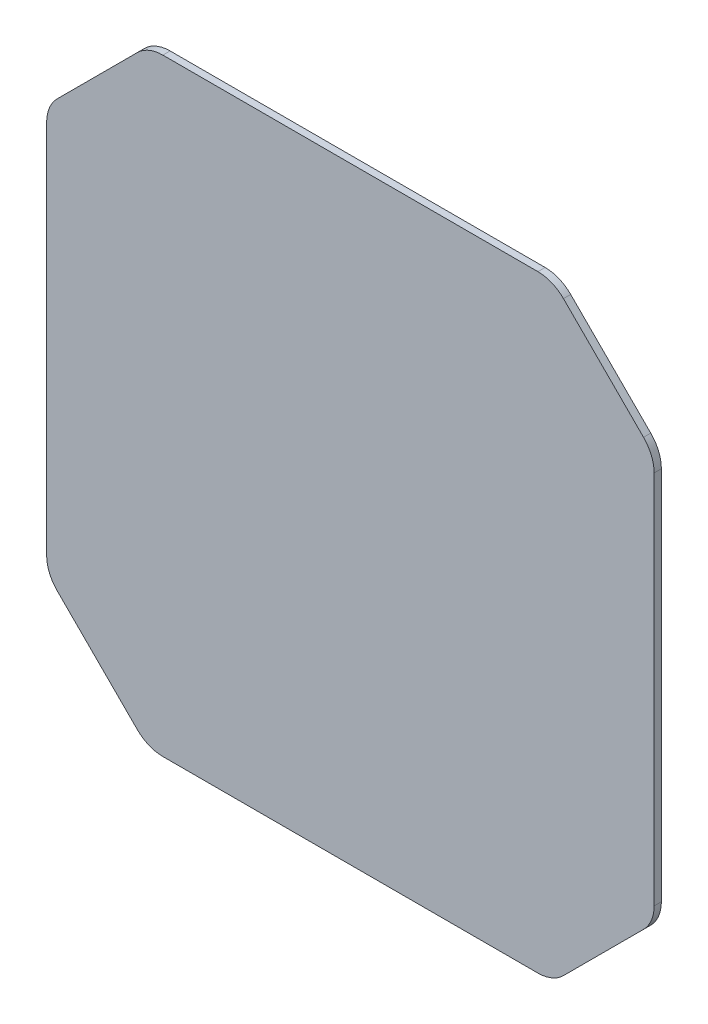
ISO-10303-21;
HEADER;
FILE_DESCRIPTION(('STEP AP214'),'2;1');
FILE_NAME('part.step','',(''),(''),'','','');
FILE_SCHEMA(('AUTOMOTIVE_DESIGN { 1 0 10303 214 1 1 1 1 }'));
ENDSEC;
DATA;
#1=APPLICATION_CONTEXT('core data for automotive mechanical design processes');
#2=APPLICATION_PROTOCOL_DEFINITION('international standard','automotive_design',2000,#1);
#3=PRODUCT_CONTEXT('',#1,'mechanical');
#4=PRODUCT('Part','Part','',(#3));
#5=PRODUCT_RELATED_PRODUCT_CATEGORY('part','',(#4));
#6=PRODUCT_DEFINITION_FORMATION('','',#4);
#7=PRODUCT_DEFINITION_CONTEXT('part definition',#1,'design');
#8=PRODUCT_DEFINITION('design','',#6,#7);
#9=PRODUCT_DEFINITION_SHAPE('','',#8);
#10=(LENGTH_UNIT() NAMED_UNIT(*) SI_UNIT(.MILLI.,.METRE.));
#11=(NAMED_UNIT(*) PLANE_ANGLE_UNIT() SI_UNIT($,.RADIAN.));
#12=(NAMED_UNIT(*) SI_UNIT($,.STERADIAN.) SOLID_ANGLE_UNIT());
#13=UNCERTAINTY_MEASURE_WITH_UNIT(LENGTH_MEASURE(1.E-05),#10,'distance_accuracy_value','');
#14=(GEOMETRIC_REPRESENTATION_CONTEXT(3) GLOBAL_UNCERTAINTY_ASSIGNED_CONTEXT((#13)) GLOBAL_UNIT_ASSIGNED_CONTEXT((#10,
#11,#12)) REPRESENTATION_CONTEXT('',''));
#15=CARTESIAN_POINT('',(0.,0.,0.));
#16=DIRECTION('',(0.,0.,1.));
#17=DIRECTION('',(1.,0.,0.));
#18=AXIS2_PLACEMENT_3D('',#15,#16,#17);
#19=CARTESIAN_POINT('',(0.,0.,19.7674418604651));
#20=DIRECTION('',(0.,0.,1.));
#21=DIRECTION('',(1.,0.,0.));
#22=AXIS2_PLACEMENT_3D('',#19,#20,#21);
#23=PLANE('',#22);
#24=CARTESIAN_POINT('',(12.9644663742583,18.5000003129244,19.7674418604651));
#25=DIRECTION('',(0.,0.,-1.));
#26=DIRECTION('',(0.382683442690248,0.923879528234466,0.));
#27=AXIS2_PLACEMENT_3D('',#24,#25,#26);
#28=CIRCLE('',#27,2.5);
#29=CARTESIAN_POINT('',(12.9644663742583,21.0000003129244,19.7674418604651));
#30=VERTEX_POINT('',#29);
#31=CARTESIAN_POINT('',(14.7322333667373,20.2677672263781,19.7674418604651));
#32=VERTEX_POINT('',#31);
#33=EDGE_CURVE('E174',#30,#32,#28,.T.);
#34=ORIENTED_EDGE('',*,*,#33,.F.);
#35=DIRECTION('',(-1.,0.,0.));
#36=VECTOR('',#35,1.);
#37=CARTESIAN_POINT('',(-14.0000003129244,21.0000003129244,19.7674418604651));
#38=LINE('',#37,#36);
#39=CARTESIAN_POINT('',(-12.9644663742583,21.0000003129244,19.7674418604651));
#40=VERTEX_POINT('',#39);
#41=EDGE_CURVE('E11',#30,#40,#38,.T.);
#42=ORIENTED_EDGE('',*,*,#41,.T.);
#43=CARTESIAN_POINT('',(-12.9644663742583,18.5000003129244,19.7674418604651));
#44=DIRECTION('',(0.,0.,-1.));
#45=DIRECTION('',(-0.382683442690248,0.923879528234466,0.));
#46=AXIS2_PLACEMENT_3D('',#43,#44,#45);
#47=CIRCLE('',#46,2.5);
#48=CARTESIAN_POINT('',(-14.7322333667373,20.2677672263781,19.7674418604651));
#49=VERTEX_POINT('',#48);
#50=EDGE_CURVE('E172',#49,#40,#47,.T.);
#51=ORIENTED_EDGE('',*,*,#50,.F.);
#52=DIRECTION('',(-0.707106765381479,-0.707106796991616,0.));
#53=VECTOR('',#52,1.);
#54=CARTESIAN_POINT('',(-21.,14.0000003129244,19.7674418604651));
#55=LINE('',#54,#53);
#56=CARTESIAN_POINT('',(-20.267766992479,14.7322333531787,19.7674418604651));
#57=VERTEX_POINT('',#56);
#58=EDGE_CURVE('E272',#49,#57,#55,.T.);
#59=ORIENTED_EDGE('',*,*,#58,.T.);
#60=CARTESIAN_POINT('',(-18.5,12.964466439725,19.7674418604651));
#61=DIRECTION('',(0.,0.,-1.));
#62=DIRECTION('',(-0.923879536788107,0.382683422039931,0.));
#63=AXIS2_PLACEMENT_3D('',#60,#61,#62);
#64=CIRCLE('',#63,2.5);
#65=CARTESIAN_POINT('',(-21.,12.964466439725,19.7674418604651));
#66=VERTEX_POINT('',#65);
#67=EDGE_CURVE('E214',#66,#57,#64,.T.);
#68=ORIENTED_EDGE('',*,*,#67,.F.);
#69=DIRECTION('',(0.,-1.,0.));
#70=VECTOR('',#69,1.);
#71=CARTESIAN_POINT('',(-21.,-14.0000003129244,19.7674418604651));
#72=LINE('',#71,#70);
#73=CARTESIAN_POINT('',(-21.,-12.964466439725,19.7674418604651));
#74=VERTEX_POINT('',#73);
#75=EDGE_CURVE('E217',#66,#74,#72,.T.);
#76=ORIENTED_EDGE('',*,*,#75,.T.);
#77=CARTESIAN_POINT('',(-18.5,-12.964466439725,19.7674418604651));
#78=DIRECTION('',(0.,0.,-1.));
#79=DIRECTION('',(-0.923879536788107,-0.382683422039931,0.));
#80=AXIS2_PLACEMENT_3D('',#77,#78,#79);
#81=CIRCLE('',#80,2.5);
#82=CARTESIAN_POINT('',(-20.267766992479,-14.7322333531787,19.7674418604651));
#83=VERTEX_POINT('',#82);
#84=EDGE_CURVE('E246',#83,#74,#81,.T.);
#85=ORIENTED_EDGE('',*,*,#84,.F.);
#86=DIRECTION('',(0.707106765381479,-0.707106796991616,0.));
#87=VECTOR('',#86,1.);
#88=CARTESIAN_POINT('',(-21.,-14.0000003129244,19.7674418604651));
#89=LINE('',#88,#87);
#90=CARTESIAN_POINT('',(-14.7322333667373,-20.2677672263781,19.7674418604651));
#91=VERTEX_POINT('',#90);
#92=EDGE_CURVE('E294',#83,#91,#89,.T.);
#93=ORIENTED_EDGE('',*,*,#92,.T.);
#94=CARTESIAN_POINT('',(-12.9644663742583,-18.5000003129244,19.7674418604651));
#95=DIRECTION('',(0.,0.,-1.));
#96=DIRECTION('',(-0.382683442690248,-0.923879528234466,0.));
#97=AXIS2_PLACEMENT_3D('',#94,#95,#96);
#98=CIRCLE('',#97,2.5);
#99=CARTESIAN_POINT('',(-12.9644663742583,-21.0000003129244,19.7674418604651));
#100=VERTEX_POINT('',#99);
#101=EDGE_CURVE('E202',#100,#91,#98,.T.);
#102=ORIENTED_EDGE('',*,*,#101,.F.);
#103=DIRECTION('',(1.,0.,0.));
#104=VECTOR('',#103,1.);
#105=CARTESIAN_POINT('',(14.0000003129244,-21.0000003129244,19.7674418604651));
#106=LINE('',#105,#104);
#107=CARTESIAN_POINT('',(12.9644663742583,-21.0000003129244,19.7674418604651));
#108=VERTEX_POINT('',#107);
#109=EDGE_CURVE('E237',#100,#108,#106,.T.);
#110=ORIENTED_EDGE('',*,*,#109,.T.);
#111=CARTESIAN_POINT('',(12.9644663742583,-18.5000003129244,19.7674418604651));
#112=DIRECTION('',(0.,0.,-1.));
#113=DIRECTION('',(0.382683442690248,-0.923879528234466,0.));
#114=AXIS2_PLACEMENT_3D('',#111,#112,#113);
#115=CIRCLE('',#114,2.5);
#116=CARTESIAN_POINT('',(14.7322333667373,-20.2677672263781,19.7674418604651));
#117=VERTEX_POINT('',#116);
#118=EDGE_CURVE('E222',#117,#108,#115,.T.);
#119=ORIENTED_EDGE('',*,*,#118,.F.);
#120=DIRECTION('',(0.707106765381478,0.707106796991616,0.));
#121=VECTOR('',#120,1.);
#122=CARTESIAN_POINT('',(21.,-14.0000003129244,19.7674418604651));
#123=LINE('',#122,#121);
#124=CARTESIAN_POINT('',(20.267766992479,-14.7322333531787,19.7674418604651));
#125=VERTEX_POINT('',#124);
#126=EDGE_CURVE('E203',#117,#125,#123,.T.);
#127=ORIENTED_EDGE('',*,*,#126,.T.);
#128=CARTESIAN_POINT('',(18.5,-12.964466439725,19.7674418604651));
#129=DIRECTION('',(0.,0.,-1.));
#130=DIRECTION('',(0.923879536788107,-0.382683422039931,0.));
#131=AXIS2_PLACEMENT_3D('',#128,#129,#130);
#132=CIRCLE('',#131,2.5);
#133=CARTESIAN_POINT('',(21.,-12.964466439725,19.7674418604651));
#134=VERTEX_POINT('',#133);
#135=EDGE_CURVE('E207',#134,#125,#132,.T.);
#136=ORIENTED_EDGE('',*,*,#135,.F.);
#137=DIRECTION('',(0.,1.,0.));
#138=VECTOR('',#137,1.);
#139=CARTESIAN_POINT('',(21.,14.0000003129244,19.7674418604651));
#140=LINE('',#139,#138);
#141=CARTESIAN_POINT('',(21.,12.964466439725,19.7674418604651));
#142=VERTEX_POINT('',#141);
#143=EDGE_CURVE('E27',#134,#142,#140,.T.);
#144=ORIENTED_EDGE('',*,*,#143,.T.);
#145=CARTESIAN_POINT('',(18.5,12.964466439725,19.7674418604651));
#146=DIRECTION('',(0.,0.,-1.));
#147=DIRECTION('',(0.923879536788107,0.382683422039931,0.));
#148=AXIS2_PLACEMENT_3D('',#145,#146,#147);
#149=CIRCLE('',#148,2.5);
#150=CARTESIAN_POINT('',(20.267766992479,14.7322333531787,19.7674418604651));
#151=VERTEX_POINT('',#150);
#152=EDGE_CURVE('E198',#151,#142,#149,.T.);
#153=ORIENTED_EDGE('',*,*,#152,.F.);
#154=DIRECTION('',(-0.707106765381479,0.707106796991616,0.));
#155=VECTOR('',#154,1.);
#156=CARTESIAN_POINT('',(21.,14.0000003129244,19.7674418604651));
#157=LINE('',#156,#155);
#158=EDGE_CURVE('E166',#151,#32,#157,.T.);
#159=ORIENTED_EDGE('',*,*,#158,.T.);
#160=EDGE_LOOP('',(#34,#42,#51,#59,#68,#76,#85,#93,#102,#110,#119,#127,#136,#144,#153,#159));
#161=FACE_BOUND('',#160,.T.);
#162=ADVANCED_FACE('F17',(#161),#23,.T.);
#163=CARTESIAN_POINT('',(14.0000003129244,21.0000003129244,19.2674418604651));
#164=DIRECTION('',(0.,1.,0.));
#165=DIRECTION('',(1.,0.,0.));
#166=AXIS2_PLACEMENT_3D('',#163,#164,#165);
#167=PLANE('',#166);
#168=DIRECTION('',(0.,0.,1.));
#169=VECTOR('',#168,1.);
#170=CARTESIAN_POINT('',(12.9644663742583,21.0000003129244,19.2674418604651));
#171=LINE('',#170,#169);
#172=CARTESIAN_POINT('',(12.9644663742583,21.0000003129244,19.2674418604651));
#173=VERTEX_POINT('',#172);
#174=EDGE_CURVE('E257',#173,#30,#171,.T.);
#175=ORIENTED_EDGE('',*,*,#174,.F.);
#176=DIRECTION('',(1.,0.,0.));
#177=VECTOR('',#176,1.);
#178=CARTESIAN_POINT('',(-14.0000003129244,21.0000003129244,19.2674418604651));
#179=LINE('',#178,#177);
#180=CARTESIAN_POINT('',(-12.9644663742583,21.0000003129244,19.2674418604651));
#181=VERTEX_POINT('',#180);
#182=EDGE_CURVE('E181',#181,#173,#179,.T.);
#183=ORIENTED_EDGE('',*,*,#182,.F.);
#184=DIRECTION('',(0.,0.,-1.));
#185=VECTOR('',#184,1.);
#186=CARTESIAN_POINT('',(-12.9644663742583,21.0000003129244,19.2674418604651));
#187=LINE('',#186,#185);
#188=EDGE_CURVE('E179',#40,#181,#187,.T.);
#189=ORIENTED_EDGE('',*,*,#188,.F.);
#190=ORIENTED_EDGE('',*,*,#41,.F.);
#191=EDGE_LOOP('',(#175,#183,#189,#190));
#192=FACE_BOUND('',#191,.T.);
#193=ADVANCED_FACE('F180',(#192),#167,.T.);
#194=CARTESIAN_POINT('',(21.,-14.0000003129244,19.2674418604651));
#195=DIRECTION('',(1.,0.,0.));
#196=DIRECTION('',(0.,1.,0.));
#197=AXIS2_PLACEMENT_3D('',#194,#195,#196);
#198=PLANE('',#197);
#199=DIRECTION('',(0.,0.,-1.));
#200=VECTOR('',#199,1.);
#201=CARTESIAN_POINT('',(21.,12.964466439725,19.2674418604651));
#202=LINE('',#201,#200);
#203=CARTESIAN_POINT('',(21.,12.964466439725,19.2674418604651));
#204=VERTEX_POINT('',#203);
#205=EDGE_CURVE('E191',#142,#204,#202,.T.);
#206=ORIENTED_EDGE('',*,*,#205,.F.);
#207=ORIENTED_EDGE('',*,*,#143,.F.);
#208=DIRECTION('',(0.,0.,1.));
#209=VECTOR('',#208,1.);
#210=CARTESIAN_POINT('',(21.,-12.964466439725,19.2674418604651));
#211=LINE('',#210,#209);
#212=CARTESIAN_POINT('',(21.,-12.964466439725,19.2674418604651));
#213=VERTEX_POINT('',#212);
#214=EDGE_CURVE('E236',#213,#134,#211,.T.);
#215=ORIENTED_EDGE('',*,*,#214,.F.);
#216=DIRECTION('',(0.,-1.,0.));
#217=VECTOR('',#216,1.);
#218=CARTESIAN_POINT('',(21.,14.0000003129244,19.2674418604651));
#219=LINE('',#218,#217);
#220=EDGE_CURVE('E228',#204,#213,#219,.T.);
#221=ORIENTED_EDGE('',*,*,#220,.F.);
#222=EDGE_LOOP('',(#206,#207,#215,#221));
#223=FACE_BOUND('',#222,.T.);
#224=ADVANCED_FACE('F520',(#223),#198,.T.);
#225=CARTESIAN_POINT('',(18.5,-12.964466439725,19.2674418604651));
#226=DIRECTION('',(0.,0.,1.));
#227=DIRECTION('',(0.923879536788107,-0.382683422039931,0.));
#228=AXIS2_PLACEMENT_3D('',#225,#226,#227);
#229=CYLINDRICAL_SURFACE('',#228,2.5);
#230=ORIENTED_EDGE('',*,*,#135,.T.);
#231=DIRECTION('',(0.,0.,-1.));
#232=VECTOR('',#231,1.);
#233=CARTESIAN_POINT('',(20.267766992479,-14.7322333531787,19.2674418604651));
#234=LINE('',#233,#232);
#235=CARTESIAN_POINT('',(20.267766992479,-14.7322333531787,19.2674418604651));
#236=VERTEX_POINT('',#235);
#237=EDGE_CURVE('E208',#125,#236,#234,.T.);
#238=ORIENTED_EDGE('',*,*,#237,.T.);
#239=CARTESIAN_POINT('',(18.5,-12.964466439725,19.2674418604651));
#240=DIRECTION('',(0.,0.,1.));
#241=DIRECTION('',(0.923879536788107,-0.382683422039931,0.));
#242=AXIS2_PLACEMENT_3D('',#239,#240,#241);
#243=CIRCLE('',#242,2.5);
#244=EDGE_CURVE('E223',#236,#213,#243,.T.);
#245=ORIENTED_EDGE('',*,*,#244,.T.);
#246=ORIENTED_EDGE('',*,*,#214,.T.);
#247=EDGE_LOOP('',(#230,#238,#245,#246));
#248=FACE_BOUND('',#247,.T.);
#249=ADVANCED_FACE('F535',(#248),#229,.T.);
#250=CARTESIAN_POINT('',(14.0000003129244,-21.0000003129244,19.2674418604651));
#251=DIRECTION('',(0.707106796991616,-0.707106765381478,0.));
#252=DIRECTION('',(0.,0.,-1.));
#253=AXIS2_PLACEMENT_3D('',#250,#251,#252);
#254=PLANE('',#253);
#255=DIRECTION('',(0.,0.,1.));
#256=VECTOR('',#255,1.);
#257=CARTESIAN_POINT('',(14.7322333667373,-20.2677672263781,19.2674418604651));
#258=LINE('',#257,#256);
#259=CARTESIAN_POINT('',(14.7322333667373,-20.2677672263781,19.2674418604651));
#260=VERTEX_POINT('',#259);
#261=EDGE_CURVE('E218',#260,#117,#258,.T.);
#262=ORIENTED_EDGE('',*,*,#261,.F.);
#263=DIRECTION('',(-0.707106765381478,-0.707106796991616,0.));
#264=VECTOR('',#263,1.);
#265=CARTESIAN_POINT('',(21.,-14.0000003129244,19.2674418604651));
#266=LINE('',#265,#264);
#267=EDGE_CURVE('E227',#236,#260,#266,.T.);
#268=ORIENTED_EDGE('',*,*,#267,.F.);
#269=ORIENTED_EDGE('',*,*,#237,.F.);
#270=ORIENTED_EDGE('',*,*,#126,.F.);
#271=EDGE_LOOP('',(#262,#268,#269,#270));
#272=FACE_BOUND('',#271,.T.);
#273=ADVANCED_FACE('F490',(#272),#254,.T.);
#274=CARTESIAN_POINT('',(12.9644663742583,-18.5000003129244,19.2674418604651));
#275=DIRECTION('',(0.,0.,1.));
#276=DIRECTION('',(0.382683442690248,-0.923879528234466,0.));
#277=AXIS2_PLACEMENT_3D('',#274,#275,#276);
#278=CYLINDRICAL_SURFACE('',#277,2.5);
#279=ORIENTED_EDGE('',*,*,#118,.T.);
#280=DIRECTION('',(0.,0.,-1.));
#281=VECTOR('',#280,1.);
#282=CARTESIAN_POINT('',(12.9644663742583,-21.0000003129244,19.2674418604651));
#283=LINE('',#282,#281);
#284=CARTESIAN_POINT('',(12.9644663742583,-21.0000003129244,19.2674418604651));
#285=VERTEX_POINT('',#284);
#286=EDGE_CURVE('E233',#108,#285,#283,.T.);
#287=ORIENTED_EDGE('',*,*,#286,.T.);
#288=CARTESIAN_POINT('',(12.9644663742583,-18.5000003129244,19.2674418604651));
#289=DIRECTION('',(0.,0.,1.));
#290=DIRECTION('',(0.382683442690248,-0.923879528234466,0.));
#291=AXIS2_PLACEMENT_3D('',#288,#289,#290);
#292=CIRCLE('',#291,2.5);
#293=EDGE_CURVE('E262',#285,#260,#292,.T.);
#294=ORIENTED_EDGE('',*,*,#293,.T.);
#295=ORIENTED_EDGE('',*,*,#261,.T.);
#296=EDGE_LOOP('',(#279,#287,#294,#295));
#297=FACE_BOUND('',#296,.T.);
#298=ADVANCED_FACE('F484',(#297),#278,.T.);
#299=CARTESIAN_POINT('',(-14.0000003129244,-21.0000003129244,19.2674418604651));
#300=DIRECTION('',(0.,-1.,0.));
#301=DIRECTION('',(0.,0.,-1.));
#302=AXIS2_PLACEMENT_3D('',#299,#300,#301);
#303=PLANE('',#302);
#304=DIRECTION('',(0.,0.,1.));
#305=VECTOR('',#304,1.);
#306=CARTESIAN_POINT('',(-12.9644663742583,-21.0000003129244,19.2674418604651));
#307=LINE('',#306,#305);
#308=CARTESIAN_POINT('',(-12.9644663742583,-21.0000003129244,19.2674418604651));
#309=VERTEX_POINT('',#308);
#310=EDGE_CURVE('E229',#309,#100,#307,.T.);
#311=ORIENTED_EDGE('',*,*,#310,.F.);
#312=DIRECTION('',(-1.,0.,0.));
#313=VECTOR('',#312,1.);
#314=CARTESIAN_POINT('',(14.0000003129244,-21.0000003129244,19.2674418604651));
#315=LINE('',#314,#313);
#316=EDGE_CURVE('E285',#285,#309,#315,.T.);
#317=ORIENTED_EDGE('',*,*,#316,.F.);
#318=ORIENTED_EDGE('',*,*,#286,.F.);
#319=ORIENTED_EDGE('',*,*,#109,.F.);
#320=EDGE_LOOP('',(#311,#317,#318,#319));
#321=FACE_BOUND('',#320,.T.);
#322=ADVANCED_FACE('F489',(#321),#303,.T.);
#323=CARTESIAN_POINT('',(-12.9644663742583,-18.5000003129244,19.2674418604651));
#324=DIRECTION('',(0.,0.,1.));
#325=DIRECTION('',(-0.382683442690248,-0.923879528234466,0.));
#326=AXIS2_PLACEMENT_3D('',#323,#324,#325);
#327=CYLINDRICAL_SURFACE('',#326,2.5);
#328=ORIENTED_EDGE('',*,*,#101,.T.);
#329=DIRECTION('',(0.,0.,-1.));
#330=VECTOR('',#329,1.);
#331=CARTESIAN_POINT('',(-14.7322333667373,-20.2677672263781,19.2674418604651));
#332=LINE('',#331,#330);
#333=CARTESIAN_POINT('',(-14.7322333667373,-20.2677672263781,19.2674418604651));
#334=VERTEX_POINT('',#333);
#335=EDGE_CURVE('E245',#91,#334,#332,.T.);
#336=ORIENTED_EDGE('',*,*,#335,.T.);
#337=CARTESIAN_POINT('',(-12.9644663742583,-18.5000003129244,19.2674418604651));
#338=DIRECTION('',(0.,0.,1.));
#339=DIRECTION('',(-0.382683442690248,-0.923879528234466,0.));
#340=AXIS2_PLACEMENT_3D('',#337,#338,#339);
#341=CIRCLE('',#340,2.5);
#342=EDGE_CURVE('E252',#334,#309,#341,.T.);
#343=ORIENTED_EDGE('',*,*,#342,.T.);
#344=ORIENTED_EDGE('',*,*,#310,.T.);
#345=EDGE_LOOP('',(#328,#336,#343,#344));
#346=FACE_BOUND('',#345,.T.);
#347=ADVANCED_FACE('F373',(#346),#327,.T.);
#348=CARTESIAN_POINT('',(-21.,-14.0000003129244,19.2674418604651));
#349=DIRECTION('',(-0.707106796991616,-0.707106765381479,0.));
#350=DIRECTION('',(-0.707106765381479,0.707106796991616,0.));
#351=AXIS2_PLACEMENT_3D('',#348,#349,#350);
#352=PLANE('',#351);
#353=DIRECTION('',(0.,0.,1.));
#354=VECTOR('',#353,1.);
#355=CARTESIAN_POINT('',(-20.267766992479,-14.7322333531787,19.2674418604651));
#356=LINE('',#355,#354);
#357=CARTESIAN_POINT('',(-20.267766992479,-14.7322333531787,19.2674418604651));
#358=VERTEX_POINT('',#357);
#359=EDGE_CURVE('E241',#358,#83,#356,.T.);
#360=ORIENTED_EDGE('',*,*,#359,.F.);
#361=DIRECTION('',(0.707106765381479,-0.707106796991616,0.));
#362=VECTOR('',#361,1.);
#363=CARTESIAN_POINT('',(-21.,-14.0000003129244,19.2674418604651));
#364=LINE('',#363,#362);
#365=EDGE_CURVE('E247',#358,#334,#364,.T.);
#366=ORIENTED_EDGE('',*,*,#365,.T.);
#367=ORIENTED_EDGE('',*,*,#335,.F.);
#368=ORIENTED_EDGE('',*,*,#92,.F.);
#369=EDGE_LOOP('',(#360,#366,#367,#368));
#370=FACE_BOUND('',#369,.T.);
#371=ADVANCED_FACE('F370',(#370),#352,.T.);
#372=CARTESIAN_POINT('',(-18.5,-12.964466439725,19.2674418604651));
#373=DIRECTION('',(0.,0.,1.));
#374=DIRECTION('',(-0.923879536788107,-0.382683422039931,0.));
#375=AXIS2_PLACEMENT_3D('',#372,#373,#374);
#376=CYLINDRICAL_SURFACE('',#375,2.5);
#377=ORIENTED_EDGE('',*,*,#84,.T.);
#378=DIRECTION('',(0.,0.,-1.));
#379=VECTOR('',#378,1.);
#380=CARTESIAN_POINT('',(-21.,-12.964466439725,19.2674418604651));
#381=LINE('',#380,#379);
#382=CARTESIAN_POINT('',(-21.,-12.964466439725,19.2674418604651));
#383=VERTEX_POINT('',#382);
#384=EDGE_CURVE('E213',#74,#383,#381,.T.);
#385=ORIENTED_EDGE('',*,*,#384,.T.);
#386=CARTESIAN_POINT('',(-18.5,-12.964466439725,19.2674418604651));
#387=DIRECTION('',(0.,0.,1.));
#388=DIRECTION('',(-0.923879536788107,-0.382683422039931,0.));
#389=AXIS2_PLACEMENT_3D('',#386,#387,#388);
#390=CIRCLE('',#389,2.5);
#391=EDGE_CURVE('E251',#383,#358,#390,.T.);
#392=ORIENTED_EDGE('',*,*,#391,.T.);
#393=ORIENTED_EDGE('',*,*,#359,.T.);
#394=EDGE_LOOP('',(#377,#385,#392,#393));
#395=FACE_BOUND('',#394,.T.);
#396=ADVANCED_FACE('F368',(#395),#376,.T.);
#397=CARTESIAN_POINT('',(-21.,14.0000003129244,19.2674418604651));
#398=DIRECTION('',(-1.,0.,0.));
#399=DIRECTION('',(0.,0.,1.));
#400=AXIS2_PLACEMENT_3D('',#397,#398,#399);
#401=PLANE('',#400);
#402=DIRECTION('',(0.,0.,1.));
#403=VECTOR('',#402,1.);
#404=CARTESIAN_POINT('',(-21.,12.964466439725,19.2674418604651));
#405=LINE('',#404,#403);
#406=CARTESIAN_POINT('',(-21.,12.964466439725,19.2674418604651));
#407=VERTEX_POINT('',#406);
#408=EDGE_CURVE('E209',#407,#66,#405,.T.);
#409=ORIENTED_EDGE('',*,*,#408,.F.);
#410=DIRECTION('',(0.,1.,0.));
#411=VECTOR('',#410,1.);
#412=CARTESIAN_POINT('',(-21.,-14.0000003129244,19.2674418604651));
#413=LINE('',#412,#411);
#414=EDGE_CURVE('E281',#383,#407,#413,.T.);
#415=ORIENTED_EDGE('',*,*,#414,.F.);
#416=ORIENTED_EDGE('',*,*,#384,.F.);
#417=ORIENTED_EDGE('',*,*,#75,.F.);
#418=EDGE_LOOP('',(#409,#415,#416,#417));
#419=FACE_BOUND('',#418,.T.);
#420=ADVANCED_FACE('F363',(#419),#401,.T.);
#421=CARTESIAN_POINT('',(-18.5,12.964466439725,19.2674418604651));
#422=DIRECTION('',(0.,0.,1.));
#423=DIRECTION('',(-0.923879536788107,0.382683422039931,0.));
#424=AXIS2_PLACEMENT_3D('',#421,#422,#423);
#425=CYLINDRICAL_SURFACE('',#424,2.5);
#426=ORIENTED_EDGE('',*,*,#67,.T.);
#427=DIRECTION('',(0.,0.,-1.));
#428=VECTOR('',#427,1.);
#429=CARTESIAN_POINT('',(-20.267766992479,14.7322333531787,19.2674418604651));
#430=LINE('',#429,#428);
#431=CARTESIAN_POINT('',(-20.267766992479,14.7322333531787,19.2674418604651));
#432=VERTEX_POINT('',#431);
#433=EDGE_CURVE('E326',#57,#432,#430,.T.);
#434=ORIENTED_EDGE('',*,*,#433,.T.);
#435=CARTESIAN_POINT('',(-18.5,12.964466439725,19.2674418604651));
#436=DIRECTION('',(0.,0.,1.));
#437=DIRECTION('',(-0.923879536788107,0.382683422039931,0.));
#438=AXIS2_PLACEMENT_3D('',#435,#436,#437);
#439=CIRCLE('',#438,2.5);
#440=EDGE_CURVE('E277',#432,#407,#439,.T.);
#441=ORIENTED_EDGE('',*,*,#440,.T.);
#442=ORIENTED_EDGE('',*,*,#408,.T.);
#443=EDGE_LOOP('',(#426,#434,#441,#442));
#444=FACE_BOUND('',#443,.T.);
#445=ADVANCED_FACE('F352',(#444),#425,.T.);
#446=CARTESIAN_POINT('',(-14.0000003129244,21.0000003129244,19.2674418604651));
#447=DIRECTION('',(-0.707106796991616,0.707106765381479,0.));
#448=DIRECTION('',(0.,0.,1.));
#449=AXIS2_PLACEMENT_3D('',#446,#447,#448);
#450=PLANE('',#449);
#451=DIRECTION('',(0.,0.,1.));
#452=VECTOR('',#451,1.);
#453=CARTESIAN_POINT('',(-14.7322333667373,20.2677672263781,19.2674418604651));
#454=LINE('',#453,#452);
#455=CARTESIAN_POINT('',(-14.7322333667373,20.2677672263781,19.2674418604651));
#456=VERTEX_POINT('',#455);
#457=EDGE_CURVE('E186',#456,#49,#454,.T.);
#458=ORIENTED_EDGE('',*,*,#457,.F.);
#459=DIRECTION('',(0.707106765381479,0.707106796991616,0.));
#460=VECTOR('',#459,1.);
#461=CARTESIAN_POINT('',(-21.,14.0000003129244,19.2674418604651));
#462=LINE('',#461,#460);
#463=EDGE_CURVE('E276',#432,#456,#462,.T.);
#464=ORIENTED_EDGE('',*,*,#463,.F.);
#465=ORIENTED_EDGE('',*,*,#433,.F.);
#466=ORIENTED_EDGE('',*,*,#58,.F.);
#467=EDGE_LOOP('',(#458,#464,#465,#466));
#468=FACE_BOUND('',#467,.T.);
#469=ADVANCED_FACE('F19',(#468),#450,.T.);
#470=CARTESIAN_POINT('',(-12.9644663742583,18.5000003129244,19.2674418604651));
#471=DIRECTION('',(0.,0.,1.));
#472=DIRECTION('',(-0.382683442690248,0.923879528234466,0.));
#473=AXIS2_PLACEMENT_3D('',#470,#471,#472);
#474=CYLINDRICAL_SURFACE('',#473,2.5);
#475=ORIENTED_EDGE('',*,*,#50,.T.);
#476=ORIENTED_EDGE('',*,*,#188,.T.);
#477=CARTESIAN_POINT('',(-12.9644663742583,18.5000003129244,19.2674418604651));
#478=DIRECTION('',(0.,0.,1.));
#479=DIRECTION('',(-0.382683442690248,0.923879528234466,0.));
#480=AXIS2_PLACEMENT_3D('',#477,#478,#479);
#481=CIRCLE('',#480,2.5);
#482=EDGE_CURVE('E273',#181,#456,#481,.T.);
#483=ORIENTED_EDGE('',*,*,#482,.T.);
#484=ORIENTED_EDGE('',*,*,#457,.T.);
#485=EDGE_LOOP('',(#475,#476,#483,#484));
#486=FACE_BOUND('',#485,.T.);
#487=ADVANCED_FACE('F189',(#486),#474,.T.);
#488=CARTESIAN_POINT('',(18.5,12.964466439725,19.2674418604651));
#489=DIRECTION('',(0.,0.,1.));
#490=DIRECTION('',(0.923879536788107,0.382683422039931,0.));
#491=AXIS2_PLACEMENT_3D('',#488,#489,#490);
#492=CYLINDRICAL_SURFACE('',#491,2.5);
#493=ORIENTED_EDGE('',*,*,#152,.T.);
#494=ORIENTED_EDGE('',*,*,#205,.T.);
#495=CARTESIAN_POINT('',(18.5,12.964466439725,19.2674418604651));
#496=DIRECTION('',(0.,0.,1.));
#497=DIRECTION('',(0.923879536788107,0.382683422039931,0.));
#498=AXIS2_PLACEMENT_3D('',#495,#496,#497);
#499=CIRCLE('',#498,2.5);
#500=CARTESIAN_POINT('',(20.267766992479,14.7322333531787,19.2674418604651));
#501=VERTEX_POINT('',#500);
#502=EDGE_CURVE('E286',#204,#501,#499,.T.);
#503=ORIENTED_EDGE('',*,*,#502,.T.);
#504=DIRECTION('',(0.,0.,1.));
#505=VECTOR('',#504,1.);
#506=CARTESIAN_POINT('',(20.267766992479,14.7322333531787,19.2674418604651));
#507=LINE('',#506,#505);
#508=EDGE_CURVE('E295',#501,#151,#507,.T.);
#509=ORIENTED_EDGE('',*,*,#508,.T.);
#510=EDGE_LOOP('',(#493,#494,#503,#509));
#511=FACE_BOUND('',#510,.T.);
#512=ADVANCED_FACE('F461',(#511),#492,.T.);
#513=CARTESIAN_POINT('',(21.,14.0000003129244,19.2674418604651));
#514=DIRECTION('',(0.707106796991616,0.707106765381479,0.));
#515=DIRECTION('',(0.,0.,-1.));
#516=AXIS2_PLACEMENT_3D('',#513,#514,#515);
#517=PLANE('',#516);
#518=DIRECTION('',(0.,0.,-1.));
#519=VECTOR('',#518,1.);
#520=CARTESIAN_POINT('',(14.7322333667373,20.2677672263781,19.2674418604651));
#521=LINE('',#520,#519);
#522=CARTESIAN_POINT('',(14.7322333667373,20.2677672263781,19.2674418604651));
#523=VERTEX_POINT('',#522);
#524=EDGE_CURVE('E258',#32,#523,#521,.T.);
#525=ORIENTED_EDGE('',*,*,#524,.F.);
#526=ORIENTED_EDGE('',*,*,#158,.F.);
#527=ORIENTED_EDGE('',*,*,#508,.F.);
#528=DIRECTION('',(-0.707106765381479,0.707106796991616,0.));
#529=VECTOR('',#528,1.);
#530=CARTESIAN_POINT('',(21.,14.0000003129244,19.2674418604651));
#531=LINE('',#530,#529);
#532=EDGE_CURVE('E154',#501,#523,#531,.T.);
#533=ORIENTED_EDGE('',*,*,#532,.T.);
#534=EDGE_LOOP('',(#525,#526,#527,#533));
#535=FACE_BOUND('',#534,.T.);
#536=ADVANCED_FACE('F552',(#535),#517,.T.);
#537=CARTESIAN_POINT('',(0.,0.,19.2674418604651));
#538=DIRECTION('',(0.,0.,1.));
#539=DIRECTION('',(1.,0.,0.));
#540=AXIS2_PLACEMENT_3D('',#537,#538,#539);
#541=PLANE('',#540);
#542=CARTESIAN_POINT('',(12.9644663742583,18.5000003129244,19.2674418604651));
#543=DIRECTION('',(0.,0.,1.));
#544=DIRECTION('',(0.382683442690248,0.923879528234466,0.));
#545=AXIS2_PLACEMENT_3D('',#542,#543,#544);
#546=CIRCLE('',#545,2.5);
#547=EDGE_CURVE('E253',#523,#173,#546,.T.);
#548=ORIENTED_EDGE('',*,*,#547,.F.);
#549=ORIENTED_EDGE('',*,*,#532,.F.);
#550=ORIENTED_EDGE('',*,*,#502,.F.);
#551=ORIENTED_EDGE('',*,*,#220,.T.);
#552=ORIENTED_EDGE('',*,*,#244,.F.);
#553=ORIENTED_EDGE('',*,*,#267,.T.);
#554=ORIENTED_EDGE('',*,*,#293,.F.);
#555=ORIENTED_EDGE('',*,*,#316,.T.);
#556=ORIENTED_EDGE('',*,*,#342,.F.);
#557=ORIENTED_EDGE('',*,*,#365,.F.);
#558=ORIENTED_EDGE('',*,*,#391,.F.);
#559=ORIENTED_EDGE('',*,*,#414,.T.);
#560=ORIENTED_EDGE('',*,*,#440,.F.);
#561=ORIENTED_EDGE('',*,*,#463,.T.);
#562=ORIENTED_EDGE('',*,*,#482,.F.);
#563=ORIENTED_EDGE('',*,*,#182,.T.);
#564=EDGE_LOOP('',(#548,#549,#550,#551,#552,#553,#554,#555,#556,#557,#558,#559,#560,#561,#562,#563));
#565=FACE_BOUND('',#564,.T.);
#566=ADVANCED_FACE('F357',(#565),#541,.F.);
#567=CARTESIAN_POINT('',(12.9644663742583,18.5000003129244,19.2674418604651));
#568=DIRECTION('',(0.,0.,1.));
#569=DIRECTION('',(0.382683442690248,0.923879528234466,0.));
#570=AXIS2_PLACEMENT_3D('',#567,#568,#569);
#571=CYLINDRICAL_SURFACE('',#570,2.5);
#572=ORIENTED_EDGE('',*,*,#33,.T.);
#573=ORIENTED_EDGE('',*,*,#524,.T.);
#574=ORIENTED_EDGE('',*,*,#547,.T.);
#575=ORIENTED_EDGE('',*,*,#174,.T.);
#576=EDGE_LOOP('',(#572,#573,#574,#575));
#577=FACE_BOUND('',#576,.T.);
#578=ADVANCED_FACE('F540',(#577),#571,.T.);
#579=CLOSED_SHELL('',(#162,#193,#224,#249,#273,#298,#322,#347,#371,#396,#420,#445,#469,#487,
#512,#536,#566,#578));
#580=MANIFOLD_SOLID_BREP('B1',#579);
#581=ADVANCED_BREP_SHAPE_REPRESENTATION('',(#18,#580),#14);
#582=SHAPE_DEFINITION_REPRESENTATION(#9,#581);
ENDSEC;
END-ISO-10303-21;
